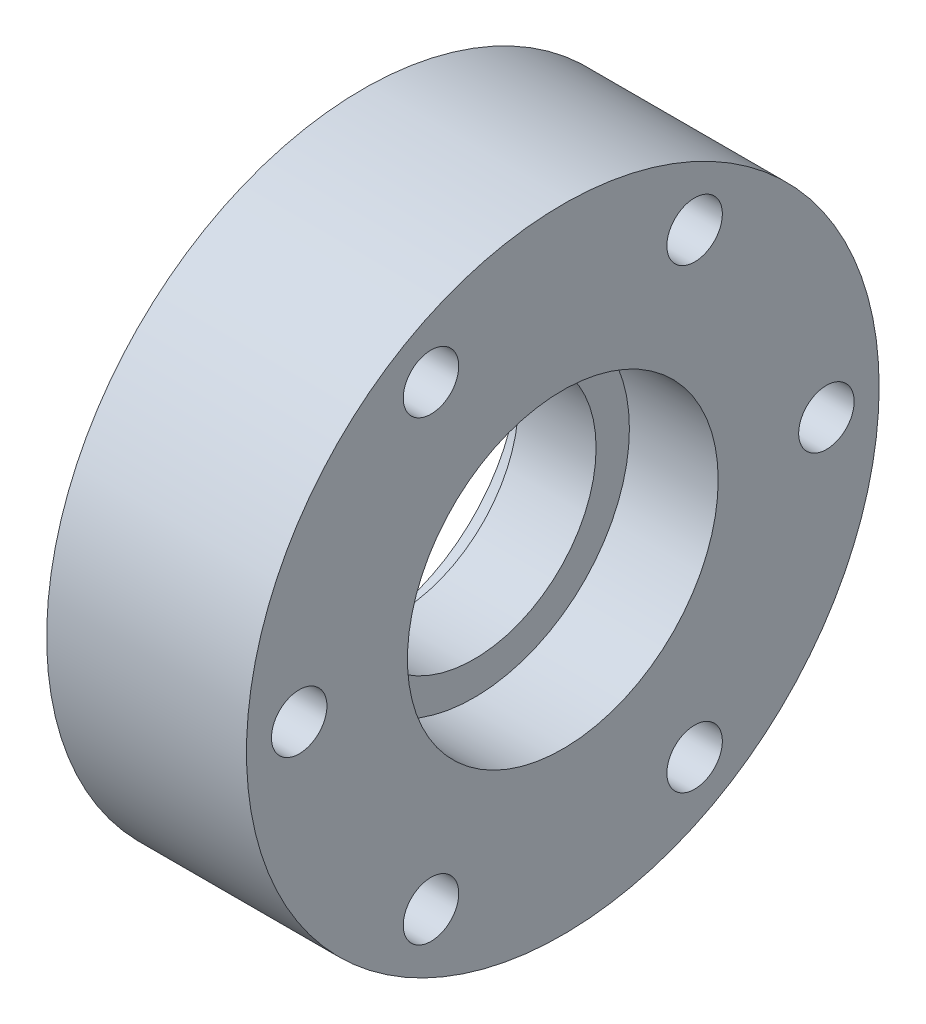
ISO-10303-21;
HEADER;
FILE_DESCRIPTION(('STEP AP214'),'2;1');
FILE_NAME('part.step','',(''),(''),'','','');
FILE_SCHEMA(('AUTOMOTIVE_DESIGN { 1 0 10303 214 1 1 1 1 }'));
ENDSEC;
DATA;
#1=APPLICATION_CONTEXT('core data for automotive mechanical design processes');
#2=APPLICATION_PROTOCOL_DEFINITION('international standard','automotive_design',2000,#1);
#3=PRODUCT_CONTEXT('',#1,'mechanical');
#4=PRODUCT('Part','Part','',(#3));
#5=PRODUCT_RELATED_PRODUCT_CATEGORY('part','',(#4));
#6=PRODUCT_DEFINITION_FORMATION('','',#4);
#7=PRODUCT_DEFINITION_CONTEXT('part definition',#1,'design');
#8=PRODUCT_DEFINITION('design','',#6,#7);
#9=PRODUCT_DEFINITION_SHAPE('','',#8);
#10=(LENGTH_UNIT() NAMED_UNIT(*) SI_UNIT(.MILLI.,.METRE.));
#11=(NAMED_UNIT(*) PLANE_ANGLE_UNIT() SI_UNIT($,.RADIAN.));
#12=(NAMED_UNIT(*) SI_UNIT($,.STERADIAN.) SOLID_ANGLE_UNIT());
#13=UNCERTAINTY_MEASURE_WITH_UNIT(LENGTH_MEASURE(1.E-05),#10,'distance_accuracy_value','');
#14=(GEOMETRIC_REPRESENTATION_CONTEXT(3) GLOBAL_UNCERTAINTY_ASSIGNED_CONTEXT((#13)) GLOBAL_UNIT_ASSIGNED_CONTEXT((#10,
#11,#12)) REPRESENTATION_CONTEXT('',''));
#15=CARTESIAN_POINT('',(0.,0.,0.));
#16=DIRECTION('',(0.,0.,1.));
#17=DIRECTION('',(1.,0.,0.));
#18=AXIS2_PLACEMENT_3D('',#15,#16,#17);
#19=CARTESIAN_POINT('',(18.,0.,0.));
#20=DIRECTION('',(-1.,0.,0.));
#21=DIRECTION('',(0.,0.,1.));
#22=AXIS2_PLACEMENT_3D('',#19,#20,#21);
#23=CYLINDRICAL_SURFACE('',#22,11.);
#24=CARTESIAN_POINT('',(10.,0.,0.));
#25=DIRECTION('',(1.,0.,0.));
#26=DIRECTION('',(0.,0.,-1.));
#27=AXIS2_PLACEMENT_3D('',#24,#25,#26);
#28=CIRCLE('',#27,11.);
#29=CARTESIAN_POINT('',(10.,0.,-11.));
#30=VERTEX_POINT('',#29);
#31=EDGE_CURVE('E83',#30,#30,#28,.T.);
#32=ORIENTED_EDGE('',*,*,#31,.T.);
#33=EDGE_LOOP('',(#32));
#34=FACE_BOUND('',#33,.T.);
#35=CARTESIAN_POINT('',(3.,0.,0.));
#36=DIRECTION('',(-1.,0.,0.));
#37=DIRECTION('',(0.,0.,1.));
#38=AXIS2_PLACEMENT_3D('',#35,#36,#37);
#39=CIRCLE('',#38,11.);
#40=CARTESIAN_POINT('',(3.,0.,11.));
#41=VERTEX_POINT('',#40);
#42=EDGE_CURVE('E92',#41,#41,#39,.T.);
#43=ORIENTED_EDGE('',*,*,#42,.T.);
#44=EDGE_LOOP('',(#43));
#45=FACE_BOUND('',#44,.T.);
#46=ADVANCED_FACE('F31',(#34,#45),#23,.F.);
#47=CARTESIAN_POINT('',(18.,0.,0.));
#48=DIRECTION('',(1.,0.,0.));
#49=DIRECTION('',(0.,0.,-1.));
#50=AXIS2_PLACEMENT_3D('',#47,#48,#49);
#51=PLANE('',#50);
#52=CARTESIAN_POINT('',(18.,0.,0.));
#53=DIRECTION('',(1.,0.,0.));
#54=DIRECTION('',(0.,0.,-1.));
#55=AXIS2_PLACEMENT_3D('',#52,#53,#54);
#56=CIRCLE('',#55,14.);
#57=CARTESIAN_POINT('',(18.,0.,-14.));
#58=VERTEX_POINT('',#57);
#59=EDGE_CURVE('E80',#58,#58,#56,.T.);
#60=ORIENTED_EDGE('',*,*,#59,.F.);
#61=EDGE_LOOP('',(#60));
#62=FACE_BOUND('',#61,.T.);
#63=CARTESIAN_POINT('',(18.,-20.5681033398805,-11.8749999999998));
#64=DIRECTION('',(1.,0.,0.));
#65=DIRECTION('',(0.,0.,-1.));
#66=AXIS2_PLACEMENT_3D('',#63,#64,#65);
#67=CIRCLE('',#66,2.5);
#68=CARTESIAN_POINT('',(18.,-20.5681033398805,-14.3749999999998));
#69=VERTEX_POINT('',#68);
#70=EDGE_CURVE('E65',#69,#69,#67,.T.);
#71=ORIENTED_EDGE('',*,*,#70,.F.);
#72=EDGE_LOOP('',(#71));
#73=FACE_BOUND('',#72,.T.);
#74=CARTESIAN_POINT('',(18.,20.5681033398804,-11.8750000000001));
#75=DIRECTION('',(1.,0.,0.));
#76=DIRECTION('',(0.,0.,-1.));
#77=AXIS2_PLACEMENT_3D('',#74,#75,#76);
#78=CIRCLE('',#77,2.5);
#79=CARTESIAN_POINT('',(18.,20.5681033398804,-14.3750000000001));
#80=VERTEX_POINT('',#79);
#81=EDGE_CURVE('E53',#80,#80,#78,.T.);
#82=ORIENTED_EDGE('',*,*,#81,.F.);
#83=EDGE_LOOP('',(#82));
#84=FACE_BOUND('',#83,.T.);
#85=CARTESIAN_POINT('',(18.,0.,23.75));
#86=DIRECTION('',(1.,0.,0.));
#87=DIRECTION('',(0.,0.,-1.));
#88=AXIS2_PLACEMENT_3D('',#85,#86,#87);
#89=CIRCLE('',#88,2.5);
#90=CARTESIAN_POINT('',(18.,0.,21.25));
#91=VERTEX_POINT('',#90);
#92=EDGE_CURVE('E42',#91,#91,#89,.T.);
#93=ORIENTED_EDGE('',*,*,#92,.F.);
#94=EDGE_LOOP('',(#93));
#95=FACE_BOUND('',#94,.T.);
#96=CARTESIAN_POINT('',(18.,0.,0.));
#97=DIRECTION('',(1.,0.,0.));
#98=DIRECTION('',(0.,0.,-1.));
#99=AXIS2_PLACEMENT_3D('',#96,#97,#98);
#100=CIRCLE('',#99,28.5);
#101=CARTESIAN_POINT('',(18.,0.,-28.5));
#102=VERTEX_POINT('',#101);
#103=EDGE_CURVE('E10',#102,#102,#100,.T.);
#104=ORIENTED_EDGE('',*,*,#103,.T.);
#105=EDGE_LOOP('',(#104));
#106=FACE_BOUND('',#105,.T.);
#107=CARTESIAN_POINT('',(18.,20.5681033398804,11.875));
#108=DIRECTION('',(1.,0.,0.));
#109=DIRECTION('',(0.,0.,-1.));
#110=AXIS2_PLACEMENT_3D('',#107,#108,#109);
#111=CIRCLE('',#110,2.5);
#112=CARTESIAN_POINT('',(18.,20.5681033398804,9.37499999999995));
#113=VERTEX_POINT('',#112);
#114=EDGE_CURVE('E47',#113,#113,#111,.T.);
#115=ORIENTED_EDGE('',*,*,#114,.F.);
#116=EDGE_LOOP('',(#115));
#117=FACE_BOUND('',#116,.T.);
#118=CARTESIAN_POINT('',(18.,-1.65845363595049E-13,-23.75));
#119=DIRECTION('',(1.,0.,0.));
#120=DIRECTION('',(0.,0.,-1.));
#121=AXIS2_PLACEMENT_3D('',#118,#119,#120);
#122=CIRCLE('',#121,2.5);
#123=CARTESIAN_POINT('',(18.,-1.65845363595049E-13,-26.25));
#124=VERTEX_POINT('',#123);
#125=EDGE_CURVE('E59',#124,#124,#122,.T.);
#126=ORIENTED_EDGE('',*,*,#125,.F.);
#127=EDGE_LOOP('',(#126));
#128=FACE_BOUND('',#127,.T.);
#129=CARTESIAN_POINT('',(18.,-20.5681033398803,11.8750000000002));
#130=DIRECTION('',(1.,0.,0.));
#131=DIRECTION('',(0.,0.,-1.));
#132=AXIS2_PLACEMENT_3D('',#129,#130,#131);
#133=CIRCLE('',#132,2.5);
#134=CARTESIAN_POINT('',(18.,-20.5681033398803,9.37500000000024));
#135=VERTEX_POINT('',#134);
#136=EDGE_CURVE('E71',#135,#135,#133,.T.);
#137=ORIENTED_EDGE('',*,*,#136,.F.);
#138=EDGE_LOOP('',(#137));
#139=FACE_BOUND('',#138,.T.);
#140=ADVANCED_FACE('F115',(#62,#73,#84,#95,#106,#117,#128,#139),#51,.T.);
#141=CARTESIAN_POINT('',(0.,0.,0.));
#142=DIRECTION('',(1.,0.,0.));
#143=DIRECTION('',(0.,0.,-1.));
#144=AXIS2_PLACEMENT_3D('',#141,#142,#143);
#145=PLANE('',#144);
#146=CARTESIAN_POINT('',(0.,0.,0.));
#147=DIRECTION('',(-1.,0.,0.));
#148=DIRECTION('',(0.,0.,1.));
#149=AXIS2_PLACEMENT_3D('',#146,#147,#148);
#150=CIRCLE('',#149,14.);
#151=CARTESIAN_POINT('',(0.,0.,14.));
#152=VERTEX_POINT('',#151);
#153=EDGE_CURVE('E89',#152,#152,#150,.T.);
#154=ORIENTED_EDGE('',*,*,#153,.F.);
#155=EDGE_LOOP('',(#154));
#156=FACE_BOUND('',#155,.T.);
#157=CARTESIAN_POINT('',(0.,0.,0.));
#158=DIRECTION('',(1.,0.,0.));
#159=DIRECTION('',(0.,0.,-1.));
#160=AXIS2_PLACEMENT_3D('',#157,#158,#159);
#161=CIRCLE('',#160,28.5);
#162=CARTESIAN_POINT('',(0.,0.,-28.5));
#163=VERTEX_POINT('',#162);
#164=EDGE_CURVE('E35',#163,#163,#161,.T.);
#165=ORIENTED_EDGE('',*,*,#164,.F.);
#166=EDGE_LOOP('',(#165));
#167=FACE_BOUND('',#166,.T.);
#168=CARTESIAN_POINT('',(0.,0.,23.75));
#169=DIRECTION('',(1.,0.,0.));
#170=DIRECTION('',(0.,0.,-1.));
#171=AXIS2_PLACEMENT_3D('',#168,#169,#170);
#172=CIRCLE('',#171,2.5);
#173=CARTESIAN_POINT('',(0.,0.,21.25));
#174=VERTEX_POINT('',#173);
#175=EDGE_CURVE('E44',#174,#174,#172,.T.);
#176=ORIENTED_EDGE('',*,*,#175,.T.);
#177=EDGE_LOOP('',(#176));
#178=FACE_BOUND('',#177,.T.);
#179=CARTESIAN_POINT('',(0.,20.5681033398804,11.875));
#180=DIRECTION('',(1.,0.,0.));
#181=DIRECTION('',(0.,0.,-1.));
#182=AXIS2_PLACEMENT_3D('',#179,#180,#181);
#183=CIRCLE('',#182,2.5);
#184=CARTESIAN_POINT('',(0.,20.5681033398804,9.37499999999995));
#185=VERTEX_POINT('',#184);
#186=EDGE_CURVE('E50',#185,#185,#183,.T.);
#187=ORIENTED_EDGE('',*,*,#186,.T.);
#188=EDGE_LOOP('',(#187));
#189=FACE_BOUND('',#188,.T.);
#190=CARTESIAN_POINT('',(0.,20.5681033398804,-11.8750000000001));
#191=DIRECTION('',(1.,0.,0.));
#192=DIRECTION('',(0.,0.,-1.));
#193=AXIS2_PLACEMENT_3D('',#190,#191,#192);
#194=CIRCLE('',#193,2.5);
#195=CARTESIAN_POINT('',(0.,20.5681033398804,-14.3750000000001));
#196=VERTEX_POINT('',#195);
#197=EDGE_CURVE('E56',#196,#196,#194,.T.);
#198=ORIENTED_EDGE('',*,*,#197,.T.);
#199=EDGE_LOOP('',(#198));
#200=FACE_BOUND('',#199,.T.);
#201=CARTESIAN_POINT('',(0.,-1.65845363595049E-13,-23.75));
#202=DIRECTION('',(1.,0.,0.));
#203=DIRECTION('',(0.,0.,-1.));
#204=AXIS2_PLACEMENT_3D('',#201,#202,#203);
#205=CIRCLE('',#204,2.5);
#206=CARTESIAN_POINT('',(0.,-1.65845363595049E-13,-26.25));
#207=VERTEX_POINT('',#206);
#208=EDGE_CURVE('E62',#207,#207,#205,.T.);
#209=ORIENTED_EDGE('',*,*,#208,.T.);
#210=EDGE_LOOP('',(#209));
#211=FACE_BOUND('',#210,.T.);
#212=CARTESIAN_POINT('',(0.,-20.5681033398805,-11.8749999999998));
#213=DIRECTION('',(1.,0.,0.));
#214=DIRECTION('',(0.,0.,-1.));
#215=AXIS2_PLACEMENT_3D('',#212,#213,#214);
#216=CIRCLE('',#215,2.5);
#217=CARTESIAN_POINT('',(0.,-20.5681033398805,-14.3749999999998));
#218=VERTEX_POINT('',#217);
#219=EDGE_CURVE('E68',#218,#218,#216,.T.);
#220=ORIENTED_EDGE('',*,*,#219,.T.);
#221=EDGE_LOOP('',(#220));
#222=FACE_BOUND('',#221,.T.);
#223=CARTESIAN_POINT('',(0.,-20.5681033398803,11.8750000000002));
#224=DIRECTION('',(1.,0.,0.));
#225=DIRECTION('',(0.,0.,-1.));
#226=AXIS2_PLACEMENT_3D('',#223,#224,#225);
#227=CIRCLE('',#226,2.5);
#228=CARTESIAN_POINT('',(0.,-20.5681033398803,9.37500000000024));
#229=VERTEX_POINT('',#228);
#230=EDGE_CURVE('E74',#229,#229,#227,.T.);
#231=ORIENTED_EDGE('',*,*,#230,.T.);
#232=EDGE_LOOP('',(#231));
#233=FACE_BOUND('',#232,.T.);
#234=ADVANCED_FACE('F112',(#156,#167,#178,#189,#200,#211,#222,#233),#145,.F.);
#235=CARTESIAN_POINT('',(18.,0.,0.));
#236=DIRECTION('',(-1.,0.,0.));
#237=DIRECTION('',(0.,0.,1.));
#238=AXIS2_PLACEMENT_3D('',#235,#236,#237);
#239=CYLINDRICAL_SURFACE('',#238,28.5);
#240=ORIENTED_EDGE('',*,*,#103,.F.);
#241=EDGE_LOOP('',(#240));
#242=FACE_BOUND('',#241,.T.);
#243=ORIENTED_EDGE('',*,*,#164,.T.);
#244=EDGE_LOOP('',(#243));
#245=FACE_BOUND('',#244,.T.);
#246=ADVANCED_FACE('F33',(#242,#245),#239,.T.);
#247=CARTESIAN_POINT('',(18.,0.,23.75));
#248=DIRECTION('',(-1.,0.,0.));
#249=DIRECTION('',(0.,0.,1.));
#250=AXIS2_PLACEMENT_3D('',#247,#248,#249);
#251=CYLINDRICAL_SURFACE('',#250,2.5);
#252=ORIENTED_EDGE('',*,*,#92,.T.);
#253=EDGE_LOOP('',(#252));
#254=FACE_BOUND('',#253,.T.);
#255=ORIENTED_EDGE('',*,*,#175,.F.);
#256=EDGE_LOOP('',(#255));
#257=FACE_BOUND('',#256,.T.);
#258=ADVANCED_FACE('F154',(#254,#257),#251,.F.);
#259=CARTESIAN_POINT('',(18.,20.5681033398804,11.875));
#260=DIRECTION('',(-1.,0.,0.));
#261=DIRECTION('',(0.,0.,1.));
#262=AXIS2_PLACEMENT_3D('',#259,#260,#261);
#263=CYLINDRICAL_SURFACE('',#262,2.5);
#264=ORIENTED_EDGE('',*,*,#114,.T.);
#265=EDGE_LOOP('',(#264));
#266=FACE_BOUND('',#265,.T.);
#267=ORIENTED_EDGE('',*,*,#186,.F.);
#268=EDGE_LOOP('',(#267));
#269=FACE_BOUND('',#268,.T.);
#270=ADVANCED_FACE('F157',(#266,#269),#263,.F.);
#271=CARTESIAN_POINT('',(18.,20.5681033398804,-11.8750000000001));
#272=DIRECTION('',(-1.,0.,0.));
#273=DIRECTION('',(0.,0.,1.));
#274=AXIS2_PLACEMENT_3D('',#271,#272,#273);
#275=CYLINDRICAL_SURFACE('',#274,2.5);
#276=ORIENTED_EDGE('',*,*,#81,.T.);
#277=EDGE_LOOP('',(#276));
#278=FACE_BOUND('',#277,.T.);
#279=ORIENTED_EDGE('',*,*,#197,.F.);
#280=EDGE_LOOP('',(#279));
#281=FACE_BOUND('',#280,.T.);
#282=ADVANCED_FACE('F161',(#278,#281),#275,.F.);
#283=CARTESIAN_POINT('',(18.,-1.65845363595049E-13,-23.75));
#284=DIRECTION('',(-1.,0.,0.));
#285=DIRECTION('',(0.,0.,1.));
#286=AXIS2_PLACEMENT_3D('',#283,#284,#285);
#287=CYLINDRICAL_SURFACE('',#286,2.5);
#288=ORIENTED_EDGE('',*,*,#125,.T.);
#289=EDGE_LOOP('',(#288));
#290=FACE_BOUND('',#289,.T.);
#291=ORIENTED_EDGE('',*,*,#208,.F.);
#292=EDGE_LOOP('',(#291));
#293=FACE_BOUND('',#292,.T.);
#294=ADVANCED_FACE('F142',(#290,#293),#287,.F.);
#295=CARTESIAN_POINT('',(18.,-20.5681033398805,-11.8749999999998));
#296=DIRECTION('',(-1.,0.,0.));
#297=DIRECTION('',(0.,0.,1.));
#298=AXIS2_PLACEMENT_3D('',#295,#296,#297);
#299=CYLINDRICAL_SURFACE('',#298,2.5);
#300=ORIENTED_EDGE('',*,*,#70,.T.);
#301=EDGE_LOOP('',(#300));
#302=FACE_BOUND('',#301,.T.);
#303=ORIENTED_EDGE('',*,*,#219,.F.);
#304=EDGE_LOOP('',(#303));
#305=FACE_BOUND('',#304,.T.);
#306=ADVANCED_FACE('F133',(#302,#305),#299,.F.);
#307=CARTESIAN_POINT('',(18.,-20.5681033398803,11.8750000000002));
#308=DIRECTION('',(-1.,0.,0.));
#309=DIRECTION('',(0.,0.,1.));
#310=AXIS2_PLACEMENT_3D('',#307,#308,#309);
#311=CYLINDRICAL_SURFACE('',#310,2.5);
#312=ORIENTED_EDGE('',*,*,#136,.T.);
#313=EDGE_LOOP('',(#312));
#314=FACE_BOUND('',#313,.T.);
#315=ORIENTED_EDGE('',*,*,#230,.F.);
#316=EDGE_LOOP('',(#315));
#317=FACE_BOUND('',#316,.T.);
#318=ADVANCED_FACE('F130',(#314,#317),#311,.F.);
#319=CARTESIAN_POINT('',(10.,0.,0.));
#320=DIRECTION('',(1.,0.,0.));
#321=DIRECTION('',(0.,0.,-1.));
#322=AXIS2_PLACEMENT_3D('',#319,#320,#321);
#323=CYLINDRICAL_SURFACE('',#322,14.);
#324=CARTESIAN_POINT('',(10.,0.,0.));
#325=DIRECTION('',(1.,0.,0.));
#326=DIRECTION('',(0.,0.,-1.));
#327=AXIS2_PLACEMENT_3D('',#324,#325,#326);
#328=CIRCLE('',#327,14.);
#329=CARTESIAN_POINT('',(10.,0.,-14.));
#330=VERTEX_POINT('',#329);
#331=EDGE_CURVE('E77',#330,#330,#328,.T.);
#332=ORIENTED_EDGE('',*,*,#331,.F.);
#333=EDGE_LOOP('',(#332));
#334=FACE_BOUND('',#333,.T.);
#335=ORIENTED_EDGE('',*,*,#59,.T.);
#336=EDGE_LOOP('',(#335));
#337=FACE_BOUND('',#336,.T.);
#338=ADVANCED_FACE('F132',(#334,#337),#323,.F.);
#339=CARTESIAN_POINT('',(10.,0.,0.));
#340=DIRECTION('',(1.,0.,0.));
#341=DIRECTION('',(0.,0.,-1.));
#342=AXIS2_PLACEMENT_3D('',#339,#340,#341);
#343=PLANE('',#342);
#344=ORIENTED_EDGE('',*,*,#31,.F.);
#345=EDGE_LOOP('',(#344));
#346=FACE_BOUND('',#345,.T.);
#347=ORIENTED_EDGE('',*,*,#331,.T.);
#348=EDGE_LOOP('',(#347));
#349=FACE_BOUND('',#348,.T.);
#350=ADVANCED_FACE('F108',(#346,#349),#343,.T.);
#351=CARTESIAN_POINT('',(3.,0.,0.));
#352=DIRECTION('',(-1.,0.,0.));
#353=DIRECTION('',(0.,0.,1.));
#354=AXIS2_PLACEMENT_3D('',#351,#352,#353);
#355=CYLINDRICAL_SURFACE('',#354,14.);
#356=CARTESIAN_POINT('',(3.,0.,0.));
#357=DIRECTION('',(-1.,0.,0.));
#358=DIRECTION('',(0.,0.,1.));
#359=AXIS2_PLACEMENT_3D('',#356,#357,#358);
#360=CIRCLE('',#359,14.);
#361=CARTESIAN_POINT('',(3.,0.,14.));
#362=VERTEX_POINT('',#361);
#363=EDGE_CURVE('E88',#362,#362,#360,.T.);
#364=ORIENTED_EDGE('',*,*,#363,.F.);
#365=EDGE_LOOP('',(#364));
#366=FACE_BOUND('',#365,.T.);
#367=ORIENTED_EDGE('',*,*,#153,.T.);
#368=EDGE_LOOP('',(#367));
#369=FACE_BOUND('',#368,.T.);
#370=ADVANCED_FACE('F102',(#366,#369),#355,.F.);
#371=CARTESIAN_POINT('',(3.,0.,0.));
#372=DIRECTION('',(-1.,0.,0.));
#373=DIRECTION('',(0.,0.,1.));
#374=AXIS2_PLACEMENT_3D('',#371,#372,#373);
#375=PLANE('',#374);
#376=ORIENTED_EDGE('',*,*,#42,.F.);
#377=EDGE_LOOP('',(#376));
#378=FACE_BOUND('',#377,.T.);
#379=ORIENTED_EDGE('',*,*,#363,.T.);
#380=EDGE_LOOP('',(#379));
#381=FACE_BOUND('',#380,.T.);
#382=ADVANCED_FACE('F99',(#378,#381),#375,.T.);
#383=CLOSED_SHELL('',(#46,#140,#234,#246,#258,#270,#282,#294,#306,#318,#338,#350,#370,#382));
#384=MANIFOLD_SOLID_BREP('B2',#383);
#385=ADVANCED_BREP_SHAPE_REPRESENTATION('',(#18,#384),#14);
#386=SHAPE_DEFINITION_REPRESENTATION(#9,#385);
ENDSEC;
END-ISO-10303-21;
